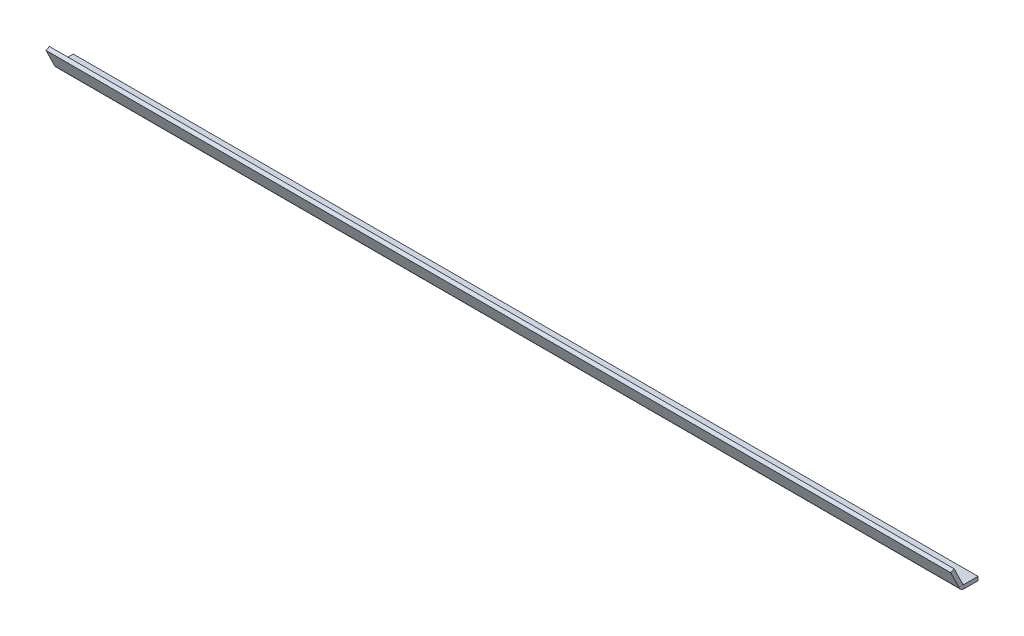
ISO-10303-21;
HEADER;
FILE_DESCRIPTION(('STEP AP214'),'2;1');
FILE_NAME('part.step','',(''),(''),'','','');
FILE_SCHEMA(('AUTOMOTIVE_DESIGN { 1 0 10303 214 1 1 1 1 }'));
ENDSEC;
DATA;
#1=APPLICATION_CONTEXT('core data for automotive mechanical design processes');
#2=APPLICATION_PROTOCOL_DEFINITION('international standard','automotive_design',2000,#1);
#3=PRODUCT_CONTEXT('',#1,'mechanical');
#4=PRODUCT('Part','Part','',(#3));
#5=PRODUCT_RELATED_PRODUCT_CATEGORY('part','',(#4));
#6=PRODUCT_DEFINITION_FORMATION('','',#4);
#7=PRODUCT_DEFINITION_CONTEXT('part definition',#1,'design');
#8=PRODUCT_DEFINITION('design','',#6,#7);
#9=PRODUCT_DEFINITION_SHAPE('','',#8);
#10=(LENGTH_UNIT() NAMED_UNIT(*) SI_UNIT(.MILLI.,.METRE.));
#11=(NAMED_UNIT(*) PLANE_ANGLE_UNIT() SI_UNIT($,.RADIAN.));
#12=(NAMED_UNIT(*) SI_UNIT($,.STERADIAN.) SOLID_ANGLE_UNIT());
#13=UNCERTAINTY_MEASURE_WITH_UNIT(LENGTH_MEASURE(1.E-05),#10,'distance_accuracy_value','');
#14=(GEOMETRIC_REPRESENTATION_CONTEXT(3) GLOBAL_UNCERTAINTY_ASSIGNED_CONTEXT((#13)) GLOBAL_UNIT_ASSIGNED_CONTEXT((#10,
#11,#12)) REPRESENTATION_CONTEXT('',''));
#15=CARTESIAN_POINT('',(0.,0.,0.));
#16=DIRECTION('',(0.,0.,1.));
#17=DIRECTION('',(1.,0.,0.));
#18=AXIS2_PLACEMENT_3D('',#15,#16,#17);
#19=CARTESIAN_POINT('',(950.,-8.,-1.78509096733731E-13));
#20=DIRECTION('',(1.,0.,0.));
#21=DIRECTION('',(0.,0.,-1.));
#22=AXIS2_PLACEMENT_3D('',#19,#20,#21);
#23=PLANE('',#22);
#24=DIRECTION('',(0.,0.,-1.));
#25=VECTOR('',#24,1.);
#26=CARTESIAN_POINT('',(950.,0.,-1.78509096733731E-13));
#27=LINE('',#26,#25);
#28=CARTESIAN_POINT('',(950.,0.,-10.7754235795296));
#29=VERTEX_POINT('',#28);
#30=CARTESIAN_POINT('',(950.,0.,-40.0000000000002));
#31=VERTEX_POINT('',#30);
#32=EDGE_CURVE('E104',#29,#31,#27,.T.);
#33=ORIENTED_EDGE('',*,*,#32,.F.);
#34=DIRECTION('',(0.,-1.,0.));
#35=VECTOR('',#34,1.);
#36=CARTESIAN_POINT('',(950.,-1.28803218091278E-13,-10.7754235795296));
#37=LINE('',#36,#35);
#38=CARTESIAN_POINT('',(950.,-8.00000000000013,-10.77542357953));
#39=VERTEX_POINT('',#38);
#40=EDGE_CURVE('E113',#29,#39,#37,.T.);
#41=ORIENTED_EDGE('',*,*,#40,.T.);
#42=DIRECTION('',(0.,0.,-1.));
#43=VECTOR('',#42,1.);
#44=CARTESIAN_POINT('',(950.,-8.,-1.78509096733731E-13));
#45=LINE('',#44,#43);
#46=CARTESIAN_POINT('',(950.,-8.,-40.0000000000002));
#47=VERTEX_POINT('',#46);
#48=EDGE_CURVE('E101',#39,#47,#45,.T.);
#49=ORIENTED_EDGE('',*,*,#48,.T.);
#50=DIRECTION('',(0.,1.,0.));
#51=VECTOR('',#50,1.);
#52=CARTESIAN_POINT('',(950.,-8.,-40.0000000000002));
#53=LINE('',#52,#51);
#54=EDGE_CURVE('E59',#47,#31,#53,.T.);
#55=ORIENTED_EDGE('',*,*,#54,.T.);
#56=EDGE_LOOP('',(#33,#41,#49,#55));
#57=FACE_BOUND('',#56,.T.);
#58=ADVANCED_FACE('F56',(#57),#23,.T.);
#59=CARTESIAN_POINT('',(0.,-8.,0.));
#60=DIRECTION('',(0.,1.,0.));
#61=DIRECTION('',(0.,0.,1.));
#62=AXIS2_PLACEMENT_3D('',#59,#60,#61);
#63=PLANE('',#62);
#64=DIRECTION('',(1.,0.,0.));
#65=VECTOR('',#64,1.);
#66=CARTESIAN_POINT('',(950.,-8.00000000000013,-10.77542357953));
#67=LINE('',#66,#65);
#68=CARTESIAN_POINT('',(-949.999999999999,-8.,-10.7754235795296));
#69=VERTEX_POINT('',#68);
#70=EDGE_CURVE('E129',#39,#69,#67,.F.);
#71=ORIENTED_EDGE('',*,*,#70,.T.);
#72=DIRECTION('',(0.,0.,1.));
#73=VECTOR('',#72,1.);
#74=CARTESIAN_POINT('',(-950.,-8.,0.));
#75=LINE('',#74,#73);
#76=CARTESIAN_POINT('',(-950.,-8.,-40.));
#77=VERTEX_POINT('',#76);
#78=EDGE_CURVE('E109',#77,#69,#75,.T.);
#79=ORIENTED_EDGE('',*,*,#78,.F.);
#80=DIRECTION('',(-1.,0.,0.));
#81=VECTOR('',#80,1.);
#82=CARTESIAN_POINT('',(950.,-8.,-40.0000000000002));
#83=LINE('',#82,#81);
#84=EDGE_CURVE('E94',#47,#77,#83,.T.);
#85=ORIENTED_EDGE('',*,*,#84,.F.);
#86=ORIENTED_EDGE('',*,*,#48,.F.);
#87=EDGE_LOOP('',(#71,#79,#85,#86));
#88=FACE_BOUND('',#87,.T.);
#89=ADVANCED_FACE('F207',(#88),#63,.F.);
#90=CARTESIAN_POINT('',(0.,0.,0.));
#91=DIRECTION('',(0.,1.,0.));
#92=DIRECTION('',(0.,0.,1.));
#93=AXIS2_PLACEMENT_3D('',#90,#91,#92);
#94=PLANE('',#93);
#95=DIRECTION('',(0.,0.,1.));
#96=VECTOR('',#95,1.);
#97=CARTESIAN_POINT('',(-950.,0.,0.));
#98=LINE('',#97,#96);
#99=CARTESIAN_POINT('',(-950.,0.,-40.));
#100=VERTEX_POINT('',#99);
#101=CARTESIAN_POINT('',(-949.999999999999,-1.28803218091278E-13,-10.7754235795296));
#102=VERTEX_POINT('',#101);
#103=EDGE_CURVE('E96',#100,#102,#98,.T.);
#104=ORIENTED_EDGE('',*,*,#103,.T.);
#105=DIRECTION('',(1.,0.,0.));
#106=VECTOR('',#105,1.);
#107=CARTESIAN_POINT('',(950.,-1.28803218091278E-13,-10.7754235795296));
#108=LINE('',#107,#106);
#109=EDGE_CURVE('E70',#29,#102,#108,.F.);
#110=ORIENTED_EDGE('',*,*,#109,.F.);
#111=ORIENTED_EDGE('',*,*,#32,.T.);
#112=DIRECTION('',(-1.,0.,0.));
#113=VECTOR('',#112,1.);
#114=CARTESIAN_POINT('',(950.,0.,-40.0000000000002));
#115=LINE('',#114,#113);
#116=EDGE_CURVE('E92',#31,#100,#115,.T.);
#117=ORIENTED_EDGE('',*,*,#116,.T.);
#118=EDGE_LOOP('',(#104,#110,#111,#117));
#119=FACE_BOUND('',#118,.T.);
#120=ADVANCED_FACE('F103',(#119),#94,.T.);
#121=CARTESIAN_POINT('',(-950.,-8.,0.));
#122=DIRECTION('',(-1.,0.,0.));
#123=DIRECTION('',(0.,0.,1.));
#124=AXIS2_PLACEMENT_3D('',#121,#122,#123);
#125=PLANE('',#124);
#126=DIRECTION('',(-1.48029736616682E-13,-1.,0.));
#127=VECTOR('',#126,1.);
#128=CARTESIAN_POINT('',(-949.999999999999,-1.28803218091278E-13,-10.7754235795296));
#129=LINE('',#128,#127);
#130=EDGE_CURVE('E100',#102,#69,#129,.T.);
#131=ORIENTED_EDGE('',*,*,#130,.F.);
#132=ORIENTED_EDGE('',*,*,#103,.F.);
#133=DIRECTION('',(0.,1.,0.));
#134=VECTOR('',#133,1.);
#135=CARTESIAN_POINT('',(-950.,-8.,-40.));
#136=LINE('',#135,#134);
#137=EDGE_CURVE('E13',#77,#100,#136,.T.);
#138=ORIENTED_EDGE('',*,*,#137,.F.);
#139=ORIENTED_EDGE('',*,*,#78,.T.);
#140=EDGE_LOOP('',(#131,#132,#138,#139));
#141=FACE_BOUND('',#140,.T.);
#142=ADVANCED_FACE('F97',(#141),#125,.T.);
#143=CARTESIAN_POINT('',(950.,-8.,-40.0000000000002));
#144=DIRECTION('',(0.,0.,-1.));
#145=DIRECTION('',(-1.,0.,0.));
#146=AXIS2_PLACEMENT_3D('',#143,#144,#145);
#147=PLANE('',#146);
#148=ORIENTED_EDGE('',*,*,#116,.F.);
#149=ORIENTED_EDGE('',*,*,#54,.F.);
#150=ORIENTED_EDGE('',*,*,#84,.T.);
#151=ORIENTED_EDGE('',*,*,#137,.T.);
#152=EDGE_LOOP('',(#148,#149,#150,#151));
#153=FACE_BOUND('',#152,.T.);
#154=ADVANCED_FACE('F89',(#153),#147,.T.);
#155=CARTESIAN_POINT('',(-949.999999999999,2.99999999999997,-10.7754235795295));
#156=DIRECTION('',(-1.,0.,0.));
#157=DIRECTION('',(0.,0.,1.));
#158=AXIS2_PLACEMENT_3D('',#155,#156,#157);
#159=PLANE('',#158);
#160=DIRECTION('',(0.,0.438371146789082,-0.898794046299165));
#161=VECTOR('',#160,1.);
#162=CARTESIAN_POINT('',(-950.,-1.82208261467989,-0.888689070238567));
#163=LINE('',#162,#161);
#164=CARTESIAN_POINT('',(-949.999999999999,1.68488655963268,-8.07904144063194));
#165=VERTEX_POINT('',#164);
#166=CARTESIAN_POINT('',(-949.999999999999,-1.82208261467997,-0.88868907023862));
#167=VERTEX_POINT('',#166);
#168=EDGE_CURVE('E134',#165,#167,#163,.F.);
#169=ORIENTED_EDGE('',*,*,#168,.F.);
#170=CARTESIAN_POINT('',(-949.999999999999,2.99999999999997,-10.7754235795295));
#171=DIRECTION('',(1.,0.,0.));
#172=DIRECTION('',(0.,0.,-1.));
#173=AXIS2_PLACEMENT_3D('',#170,#171,#172);
#174=CIRCLE('',#173,3.0000000000001);
#175=EDGE_CURVE('E123',#102,#165,#174,.F.);
#176=ORIENTED_EDGE('',*,*,#175,.F.);
#177=ORIENTED_EDGE('',*,*,#130,.T.);
#178=CARTESIAN_POINT('',(-949.999999999999,2.99999999999997,-10.7754235795295));
#179=DIRECTION('',(1.,0.,0.));
#180=DIRECTION('',(0.,0.,-1.));
#181=AXIS2_PLACEMENT_3D('',#178,#179,#180);
#182=CIRCLE('',#181,11.0000000000001);
#183=EDGE_CURVE('E116',#69,#167,#182,.F.);
#184=ORIENTED_EDGE('',*,*,#183,.T.);
#185=EDGE_LOOP('',(#169,#176,#177,#184));
#186=FACE_BOUND('',#185,.T.);
#187=ADVANCED_FACE('F211',(#186),#159,.T.);
#188=CARTESIAN_POINT('',(950.,2.99999999999997,-10.7754235795295));
#189=DIRECTION('',(-1.,0.,0.));
#190=DIRECTION('',(0.,0.,1.));
#191=AXIS2_PLACEMENT_3D('',#188,#189,#190);
#192=PLANE('',#191);
#193=CARTESIAN_POINT('',(950.,2.99999999999997,-10.7754235795295));
#194=DIRECTION('',(1.,0.,0.));
#195=DIRECTION('',(0.,0.,-1.));
#196=AXIS2_PLACEMENT_3D('',#193,#194,#195);
#197=CIRCLE('',#196,3.0000000000001);
#198=CARTESIAN_POINT('',(950.,1.68488655963268,-8.07904144063194));
#199=VERTEX_POINT('',#198);
#200=EDGE_CURVE('E118',#199,#29,#197,.T.);
#201=ORIENTED_EDGE('',*,*,#200,.F.);
#202=DIRECTION('',(0.,0.438371146789082,-0.898794046299165));
#203=VECTOR('',#202,1.);
#204=CARTESIAN_POINT('',(950.,1.68488655963269,-8.07904144063218));
#205=LINE('',#204,#203);
#206=CARTESIAN_POINT('',(950.,-1.82208261467997,-0.888689070238845));
#207=VERTEX_POINT('',#206);
#208=EDGE_CURVE('E140',#199,#207,#205,.F.);
#209=ORIENTED_EDGE('',*,*,#208,.T.);
#210=CARTESIAN_POINT('',(950.,2.99999999999997,-10.7754235795295));
#211=DIRECTION('',(1.,0.,0.));
#212=DIRECTION('',(0.,0.,-1.));
#213=AXIS2_PLACEMENT_3D('',#210,#211,#212);
#214=CIRCLE('',#213,11.0000000000001);
#215=EDGE_CURVE('E126',#207,#39,#214,.T.);
#216=ORIENTED_EDGE('',*,*,#215,.T.);
#217=ORIENTED_EDGE('',*,*,#40,.F.);
#218=EDGE_LOOP('',(#201,#209,#216,#217));
#219=FACE_BOUND('',#218,.T.);
#220=ADVANCED_FACE('F221',(#219),#192,.F.);
#221=CARTESIAN_POINT('',(950.,2.99999999999997,-10.7754235795295));
#222=DIRECTION('',(1.,0.,0.));
#223=DIRECTION('',(0.,-0.438371146789082,0.898794046299165));
#224=AXIS2_PLACEMENT_3D('',#221,#222,#223);
#225=CYLINDRICAL_SURFACE('',#224,11.0000000000001);
#226=ORIENTED_EDGE('',*,*,#70,.F.);
#227=ORIENTED_EDGE('',*,*,#215,.F.);
#228=DIRECTION('',(1.,0.,0.));
#229=VECTOR('',#228,1.);
#230=CARTESIAN_POINT('',(-950.,-1.82208261467988,-0.888689070238569));
#231=LINE('',#230,#229);
#232=EDGE_CURVE('E143',#207,#167,#231,.F.);
#233=ORIENTED_EDGE('',*,*,#232,.T.);
#234=ORIENTED_EDGE('',*,*,#183,.F.);
#235=EDGE_LOOP('',(#226,#227,#233,#234));
#236=FACE_BOUND('',#235,.T.);
#237=ADVANCED_FACE('F212',(#236),#225,.T.);
#238=CARTESIAN_POINT('',(950.,2.99999999999997,-10.7754235795295));
#239=DIRECTION('',(1.,0.,0.));
#240=DIRECTION('',(0.,-0.438371146789082,0.898794046299165));
#241=AXIS2_PLACEMENT_3D('',#238,#239,#240);
#242=CYLINDRICAL_SURFACE('',#241,3.0000000000001);
#243=ORIENTED_EDGE('',*,*,#109,.T.);
#244=ORIENTED_EDGE('',*,*,#175,.T.);
#245=DIRECTION('',(1.,0.,0.));
#246=VECTOR('',#245,1.);
#247=CARTESIAN_POINT('',(-950.,1.68488655963278,-8.07904144063191));
#248=LINE('',#247,#246);
#249=EDGE_CURVE('E137',#165,#199,#248,.T.);
#250=ORIENTED_EDGE('',*,*,#249,.T.);
#251=ORIENTED_EDGE('',*,*,#200,.T.);
#252=EDGE_LOOP('',(#243,#244,#250,#251));
#253=FACE_BOUND('',#252,.T.);
#254=ADVANCED_FACE('F224',(#253),#242,.F.);
#255=CARTESIAN_POINT('',(-950.,-3.50696917431268,-1.71046315340811));
#256=DIRECTION('',(1.,0.,0.));
#257=DIRECTION('',(0.,1.,0.));
#258=AXIS2_PLACEMENT_3D('',#255,#256,#257);
#259=PLANE('',#258);
#260=ORIENTED_EDGE('',*,*,#168,.T.);
#261=DIRECTION('',(0.,-0.898794046299165,-0.438371146789082));
#262=VECTOR('',#261,1.);
#263=CARTESIAN_POINT('',(-950.,-3.5069691743149,-1.71046315340919));
#264=LINE('',#263,#262);
#265=CARTESIAN_POINT('',(-950.,35.1421142223599,17.1399543373491));
#266=VERTEX_POINT('',#265);
#267=EDGE_CURVE('E155',#266,#167,#264,.T.);
#268=ORIENTED_EDGE('',*,*,#267,.F.);
#269=DIRECTION('',(0.,0.438371146789082,-0.898794046299165));
#270=VECTOR('',#269,1.);
#271=CARTESIAN_POINT('',(-950.,35.1421142223599,17.1399543373491));
#272=LINE('',#271,#270);
#273=CARTESIAN_POINT('',(-950.,38.6490833966726,9.94960196695578));
#274=VERTEX_POINT('',#273);
#275=EDGE_CURVE('E164',#266,#274,#272,.T.);
#276=ORIENTED_EDGE('',*,*,#275,.T.);
#277=DIRECTION('',(0.,0.898794046299165,0.438371146789082));
#278=VECTOR('',#277,1.);
#279=CARTESIAN_POINT('',(-950.,0.,-8.90081552380143));
#280=LINE('',#279,#278);
#281=EDGE_CURVE('E146',#274,#165,#280,.F.);
#282=ORIENTED_EDGE('',*,*,#281,.T.);
#283=EDGE_LOOP('',(#260,#268,#276,#282));
#284=FACE_BOUND('',#283,.T.);
#285=ADVANCED_FACE('F190',(#284),#259,.F.);
#286=CARTESIAN_POINT('',(950.,35.1421142223599,17.1399543373489));
#287=DIRECTION('',(-1.,0.,0.));
#288=DIRECTION('',(0.,-1.,0.));
#289=AXIS2_PLACEMENT_3D('',#286,#287,#288);
#290=PLANE('',#289);
#291=ORIENTED_EDGE('',*,*,#208,.F.);
#292=DIRECTION('',(0.,-0.898794046299165,-0.438371146789082));
#293=VECTOR('',#292,1.);
#294=CARTESIAN_POINT('',(950.,38.6490833966726,9.94960196695554));
#295=LINE('',#294,#293);
#296=CARTESIAN_POINT('',(950.,38.6490833966726,9.94960196695554));
#297=VERTEX_POINT('',#296);
#298=EDGE_CURVE('E149',#199,#297,#295,.F.);
#299=ORIENTED_EDGE('',*,*,#298,.T.);
#300=DIRECTION('',(0.,0.438371146789082,-0.898794046299165));
#301=VECTOR('',#300,1.);
#302=CARTESIAN_POINT('',(950.,35.1421142223599,17.1399543373489));
#303=LINE('',#302,#301);
#304=CARTESIAN_POINT('',(950.,35.1421142223599,17.1399543373489));
#305=VERTEX_POINT('',#304);
#306=EDGE_CURVE('E121',#305,#297,#303,.T.);
#307=ORIENTED_EDGE('',*,*,#306,.F.);
#308=DIRECTION('',(0.,0.898794046299165,0.438371146789082));
#309=VECTOR('',#308,1.);
#310=CARTESIAN_POINT('',(950.,-3.50696917431481,-1.71046315340938));
#311=LINE('',#310,#309);
#312=EDGE_CURVE('E158',#207,#305,#311,.T.);
#313=ORIENTED_EDGE('',*,*,#312,.F.);
#314=EDGE_LOOP('',(#291,#299,#307,#313));
#315=FACE_BOUND('',#314,.T.);
#316=ADVANCED_FACE('F218',(#315),#290,.F.);
#317=CARTESIAN_POINT('',(0.,-3.50696917431265,-1.71046315340821));
#318=DIRECTION('',(0.,0.438371146789082,-0.898794046299165));
#319=DIRECTION('',(0.,0.898794046299165,0.438371146789082));
#320=AXIS2_PLACEMENT_3D('',#317,#318,#319);
#321=PLANE('',#320);
#322=ORIENTED_EDGE('',*,*,#232,.F.);
#323=ORIENTED_EDGE('',*,*,#312,.T.);
#324=DIRECTION('',(-1.,0.,0.));
#325=VECTOR('',#324,1.);
#326=CARTESIAN_POINT('',(0.,35.1421142223599,17.139954337349));
#327=LINE('',#326,#325);
#328=EDGE_CURVE('E161',#305,#266,#327,.T.);
#329=ORIENTED_EDGE('',*,*,#328,.T.);
#330=ORIENTED_EDGE('',*,*,#267,.T.);
#331=EDGE_LOOP('',(#322,#323,#329,#330));
#332=FACE_BOUND('',#331,.T.);
#333=ADVANCED_FACE('F215',(#332),#321,.F.);
#334=CARTESIAN_POINT('',(0.,0.,-8.90081552380154));
#335=DIRECTION('',(0.,0.438371146789082,-0.898794046299165));
#336=DIRECTION('',(0.,0.898794046299165,0.438371146789082));
#337=AXIS2_PLACEMENT_3D('',#334,#335,#336);
#338=PLANE('',#337);
#339=ORIENTED_EDGE('',*,*,#298,.F.);
#340=ORIENTED_EDGE('',*,*,#249,.F.);
#341=ORIENTED_EDGE('',*,*,#281,.F.);
#342=DIRECTION('',(1.,0.,0.));
#343=VECTOR('',#342,1.);
#344=CARTESIAN_POINT('',(-950.,38.6490833966726,9.94960196695578));
#345=LINE('',#344,#343);
#346=EDGE_CURVE('E152',#297,#274,#345,.F.);
#347=ORIENTED_EDGE('',*,*,#346,.F.);
#348=EDGE_LOOP('',(#339,#340,#341,#347));
#349=FACE_BOUND('',#348,.T.);
#350=ADVANCED_FACE('F184',(#349),#338,.T.);
#351=CARTESIAN_POINT('',(-950.,35.1421142223599,17.1399543373491));
#352=DIRECTION('',(0.,-0.898794046299165,-0.438371146789082));
#353=DIRECTION('',(0.,0.438371146789082,-0.898794046299165));
#354=AXIS2_PLACEMENT_3D('',#351,#352,#353);
#355=PLANE('',#354);
#356=ORIENTED_EDGE('',*,*,#346,.T.);
#357=ORIENTED_EDGE('',*,*,#275,.F.);
#358=ORIENTED_EDGE('',*,*,#328,.F.);
#359=ORIENTED_EDGE('',*,*,#306,.T.);
#360=EDGE_LOOP('',(#356,#357,#358,#359));
#361=FACE_BOUND('',#360,.T.);
#362=ADVANCED_FACE('F173',(#361),#355,.F.);
#363=CLOSED_SHELL('',(#58,#89,#120,#142,#154,#187,#220,#237,#254,#285,#316,#333,#350,#362));
#364=MANIFOLD_SOLID_BREP('B2',#363);
#365=ADVANCED_BREP_SHAPE_REPRESENTATION('',(#18,#364),#14);
#366=SHAPE_DEFINITION_REPRESENTATION(#9,#365);
ENDSEC;
END-ISO-10303-21;
